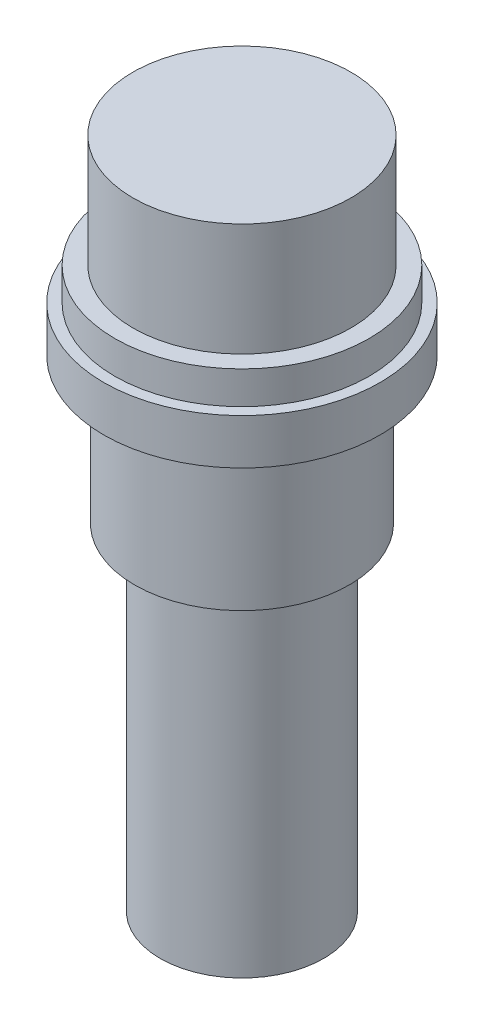
ISO-10303-21;
HEADER;
FILE_DESCRIPTION(('STEP AP214'),'2;1');
FILE_NAME('part.step','',(''),(''),'','','');
FILE_SCHEMA(('AUTOMOTIVE_DESIGN { 1 0 10303 214 1 1 1 1 }'));
ENDSEC;
DATA;
#1=APPLICATION_CONTEXT('core data for automotive mechanical design processes');
#2=APPLICATION_PROTOCOL_DEFINITION('international standard','automotive_design',2000,#1);
#3=PRODUCT_CONTEXT('',#1,'mechanical');
#4=PRODUCT('Part','Part','',(#3));
#5=PRODUCT_RELATED_PRODUCT_CATEGORY('part','',(#4));
#6=PRODUCT_DEFINITION_FORMATION('','',#4);
#7=PRODUCT_DEFINITION_CONTEXT('part definition',#1,'design');
#8=PRODUCT_DEFINITION('design','',#6,#7);
#9=PRODUCT_DEFINITION_SHAPE('','',#8);
#10=(LENGTH_UNIT() NAMED_UNIT(*) SI_UNIT(.MILLI.,.METRE.));
#11=(NAMED_UNIT(*) PLANE_ANGLE_UNIT() SI_UNIT($,.RADIAN.));
#12=(NAMED_UNIT(*) SI_UNIT($,.STERADIAN.) SOLID_ANGLE_UNIT());
#13=UNCERTAINTY_MEASURE_WITH_UNIT(LENGTH_MEASURE(1.E-05),#10,'distance_accuracy_value','');
#14=(GEOMETRIC_REPRESENTATION_CONTEXT(3) GLOBAL_UNCERTAINTY_ASSIGNED_CONTEXT((#13)) GLOBAL_UNIT_ASSIGNED_CONTEXT((#10,
#11,#12)) REPRESENTATION_CONTEXT('',''));
#15=CARTESIAN_POINT('',(0.,0.,0.));
#16=DIRECTION('',(0.,0.,1.));
#17=DIRECTION('',(1.,0.,0.));
#18=AXIS2_PLACEMENT_3D('',#15,#16,#17);
#19=CARTESIAN_POINT('',(4.50000000000001,-6.06130564302276,0.));
#20=DIRECTION('',(0.,1.,0.));
#21=DIRECTION('',(0.,0.,1.));
#22=AXIS2_PLACEMENT_3D('',#19,#20,#21);
#23=PLANE('',#22);
#24=CARTESIAN_POINT('',(0.,-6.06130564302276,0.));
#25=DIRECTION('',(0.,1.,0.));
#26=DIRECTION('',(0.,0.,1.));
#27=AXIS2_PLACEMENT_3D('',#24,#25,#26);
#28=CIRCLE('',#27,4.50000000000001);
#29=CARTESIAN_POINT('',(0.,-6.06130564302276,4.50000000000001));
#30=VERTEX_POINT('',#29);
#31=EDGE_CURVE('E10',#30,#30,#28,.T.);
#32=ORIENTED_EDGE('',*,*,#31,.F.);
#33=EDGE_LOOP('',(#32));
#34=FACE_BOUND('',#33,.T.);
#35=ADVANCED_FACE('F34',(#34),#23,.F.);
#36=CARTESIAN_POINT('',(0.,77.7218259629101,0.));
#37=DIRECTION('',(0.,1.,0.));
#38=DIRECTION('',(0.,0.,1.));
#39=AXIS2_PLACEMENT_3D('',#36,#37,#38);
#40=CYLINDRICAL_SURFACE('',#39,4.50000000000001);
#41=CARTESIAN_POINT('',(0.,12.4386943569772,0.));
#42=DIRECTION('',(0.,1.,0.));
#43=DIRECTION('',(0.,0.,1.));
#44=AXIS2_PLACEMENT_3D('',#41,#42,#43);
#45=CIRCLE('',#44,4.50000000000001);
#46=CARTESIAN_POINT('',(0.,12.4386943569772,4.50000000000001));
#47=VERTEX_POINT('',#46);
#48=EDGE_CURVE('E40',#47,#47,#45,.T.);
#49=ORIENTED_EDGE('',*,*,#48,.F.);
#50=EDGE_LOOP('',(#49));
#51=FACE_BOUND('',#50,.T.);
#52=ORIENTED_EDGE('',*,*,#31,.T.);
#53=EDGE_LOOP('',(#52));
#54=FACE_BOUND('',#53,.T.);
#55=ADVANCED_FACE('F118',(#51,#54),#40,.T.);
#56=CARTESIAN_POINT('',(5.90000000000001,12.4386943569772,0.));
#57=DIRECTION('',(0.,1.,0.));
#58=DIRECTION('',(0.,0.,1.));
#59=AXIS2_PLACEMENT_3D('',#56,#57,#58);
#60=PLANE('',#59);
#61=CARTESIAN_POINT('',(0.,12.4386943569772,0.));
#62=DIRECTION('',(0.,1.,0.));
#63=DIRECTION('',(0.,0.,1.));
#64=AXIS2_PLACEMENT_3D('',#61,#62,#63);
#65=CIRCLE('',#64,5.90000000000001);
#66=CARTESIAN_POINT('',(0.,12.4386943569772,5.90000000000001));
#67=VERTEX_POINT('',#66);
#68=EDGE_CURVE('E44',#67,#67,#65,.T.);
#69=ORIENTED_EDGE('',*,*,#68,.F.);
#70=EDGE_LOOP('',(#69));
#71=FACE_BOUND('',#70,.T.);
#72=ORIENTED_EDGE('',*,*,#48,.T.);
#73=EDGE_LOOP('',(#72));
#74=FACE_BOUND('',#73,.T.);
#75=ADVANCED_FACE('F113',(#71,#74),#60,.F.);
#76=CARTESIAN_POINT('',(0.,77.7218259629101,0.));
#77=DIRECTION('',(0.,1.,0.));
#78=DIRECTION('',(0.,0.,1.));
#79=AXIS2_PLACEMENT_3D('',#76,#77,#78);
#80=CYLINDRICAL_SURFACE('',#79,5.90000000000001);
#81=CARTESIAN_POINT('',(0.,20.4386943569772,0.));
#82=DIRECTION('',(0.,1.,0.));
#83=DIRECTION('',(0.,0.,1.));
#84=AXIS2_PLACEMENT_3D('',#81,#82,#83);
#85=CIRCLE('',#84,5.90000000000001);
#86=CARTESIAN_POINT('',(0.,20.4386943569772,5.90000000000001));
#87=VERTEX_POINT('',#86);
#88=EDGE_CURVE('E48',#87,#87,#85,.T.);
#89=ORIENTED_EDGE('',*,*,#88,.F.);
#90=EDGE_LOOP('',(#89));
#91=FACE_BOUND('',#90,.T.);
#92=ORIENTED_EDGE('',*,*,#68,.T.);
#93=EDGE_LOOP('',(#92));
#94=FACE_BOUND('',#93,.T.);
#95=ADVANCED_FACE('F107',(#91,#94),#80,.T.);
#96=CARTESIAN_POINT('',(7.60000000000001,20.4386943569772,0.));
#97=DIRECTION('',(0.,1.,0.));
#98=DIRECTION('',(0.,0.,1.));
#99=AXIS2_PLACEMENT_3D('',#96,#97,#98);
#100=PLANE('',#99);
#101=CARTESIAN_POINT('',(0.,20.4386943569772,0.));
#102=DIRECTION('',(0.,1.,0.));
#103=DIRECTION('',(0.,0.,1.));
#104=AXIS2_PLACEMENT_3D('',#101,#102,#103);
#105=CIRCLE('',#104,7.60000000000001);
#106=CARTESIAN_POINT('',(0.,20.4386943569772,7.60000000000001));
#107=VERTEX_POINT('',#106);
#108=EDGE_CURVE('E53',#107,#107,#105,.T.);
#109=ORIENTED_EDGE('',*,*,#108,.F.);
#110=EDGE_LOOP('',(#109));
#111=FACE_BOUND('',#110,.T.);
#112=ORIENTED_EDGE('',*,*,#88,.T.);
#113=EDGE_LOOP('',(#112));
#114=FACE_BOUND('',#113,.T.);
#115=ADVANCED_FACE('F101',(#111,#114),#100,.F.);
#116=CARTESIAN_POINT('',(0.,77.7218259629101,0.));
#117=DIRECTION('',(0.,1.,0.));
#118=DIRECTION('',(0.,0.,1.));
#119=AXIS2_PLACEMENT_3D('',#116,#117,#118);
#120=CYLINDRICAL_SURFACE('',#119,7.60000000000001);
#121=CARTESIAN_POINT('',(0.,22.9386943569772,0.));
#122=DIRECTION('',(0.,1.,0.));
#123=DIRECTION('',(0.,0.,1.));
#124=AXIS2_PLACEMENT_3D('',#121,#122,#123);
#125=CIRCLE('',#124,7.60000000000001);
#126=CARTESIAN_POINT('',(0.,22.9386943569772,7.60000000000001));
#127=VERTEX_POINT('',#126);
#128=EDGE_CURVE('E56',#127,#127,#125,.T.);
#129=ORIENTED_EDGE('',*,*,#128,.F.);
#130=EDGE_LOOP('',(#129));
#131=FACE_BOUND('',#130,.T.);
#132=ORIENTED_EDGE('',*,*,#108,.T.);
#133=EDGE_LOOP('',(#132));
#134=FACE_BOUND('',#133,.T.);
#135=ADVANCED_FACE('F95',(#131,#134),#120,.T.);
#136=CARTESIAN_POINT('',(7.00000000000001,22.9386943569772,0.));
#137=DIRECTION('',(0.,-1.,0.));
#138=DIRECTION('',(0.,0.,-1.));
#139=AXIS2_PLACEMENT_3D('',#136,#137,#138);
#140=PLANE('',#139);
#141=CARTESIAN_POINT('',(0.,22.9386943569772,0.));
#142=DIRECTION('',(0.,1.,0.));
#143=DIRECTION('',(0.,0.,1.));
#144=AXIS2_PLACEMENT_3D('',#141,#142,#143);
#145=CIRCLE('',#144,7.00000000000001);
#146=CARTESIAN_POINT('',(0.,22.9386943569772,7.00000000000001));
#147=VERTEX_POINT('',#146);
#148=EDGE_CURVE('E59',#147,#147,#145,.T.);
#149=ORIENTED_EDGE('',*,*,#148,.F.);
#150=EDGE_LOOP('',(#149));
#151=FACE_BOUND('',#150,.T.);
#152=ORIENTED_EDGE('',*,*,#128,.T.);
#153=EDGE_LOOP('',(#152));
#154=FACE_BOUND('',#153,.T.);
#155=ADVANCED_FACE('F89',(#151,#154),#140,.F.);
#156=CARTESIAN_POINT('',(0.,77.7218259629101,0.));
#157=DIRECTION('',(0.,1.,0.));
#158=DIRECTION('',(0.,0.,1.));
#159=AXIS2_PLACEMENT_3D('',#156,#157,#158);
#160=CYLINDRICAL_SURFACE('',#159,7.00000000000001);
#161=CARTESIAN_POINT('',(0.,24.7386943569772,0.));
#162=DIRECTION('',(0.,1.,0.));
#163=DIRECTION('',(0.,0.,1.));
#164=AXIS2_PLACEMENT_3D('',#161,#162,#163);
#165=CIRCLE('',#164,7.00000000000001);
#166=CARTESIAN_POINT('',(0.,24.7386943569772,7.00000000000001));
#167=VERTEX_POINT('',#166);
#168=EDGE_CURVE('E62',#167,#167,#165,.T.);
#169=ORIENTED_EDGE('',*,*,#168,.F.);
#170=EDGE_LOOP('',(#169));
#171=FACE_BOUND('',#170,.T.);
#172=ORIENTED_EDGE('',*,*,#148,.T.);
#173=EDGE_LOOP('',(#172));
#174=FACE_BOUND('',#173,.T.);
#175=ADVANCED_FACE('F83',(#171,#174),#160,.T.);
#176=CARTESIAN_POINT('',(6.00000000000001,24.7386943569772,0.));
#177=DIRECTION('',(0.,-1.,0.));
#178=DIRECTION('',(0.,0.,-1.));
#179=AXIS2_PLACEMENT_3D('',#176,#177,#178);
#180=PLANE('',#179);
#181=CARTESIAN_POINT('',(0.,24.7386943569772,0.));
#182=DIRECTION('',(0.,1.,0.));
#183=DIRECTION('',(0.,0.,1.));
#184=AXIS2_PLACEMENT_3D('',#181,#182,#183);
#185=CIRCLE('',#184,6.00000000000001);
#186=CARTESIAN_POINT('',(0.,24.7386943569772,6.00000000000001));
#187=VERTEX_POINT('',#186);
#188=EDGE_CURVE('E65',#187,#187,#185,.T.);
#189=ORIENTED_EDGE('',*,*,#188,.F.);
#190=EDGE_LOOP('',(#189));
#191=FACE_BOUND('',#190,.T.);
#192=ORIENTED_EDGE('',*,*,#168,.T.);
#193=EDGE_LOOP('',(#192));
#194=FACE_BOUND('',#193,.T.);
#195=ADVANCED_FACE('F77',(#191,#194),#180,.F.);
#196=CARTESIAN_POINT('',(0.,77.7218259629101,0.));
#197=DIRECTION('',(0.,1.,0.));
#198=DIRECTION('',(0.,0.,1.));
#199=AXIS2_PLACEMENT_3D('',#196,#197,#198);
#200=CYLINDRICAL_SURFACE('',#199,6.00000000000001);
#201=CARTESIAN_POINT('',(0.,30.9386943569772,0.));
#202=DIRECTION('',(0.,1.,0.));
#203=DIRECTION('',(0.,0.,1.));
#204=AXIS2_PLACEMENT_3D('',#201,#202,#203);
#205=CIRCLE('',#204,6.00000000000001);
#206=CARTESIAN_POINT('',(0.,30.9386943569772,6.00000000000001));
#207=VERTEX_POINT('',#206);
#208=EDGE_CURVE('E68',#207,#207,#205,.T.);
#209=ORIENTED_EDGE('',*,*,#208,.F.);
#210=EDGE_LOOP('',(#209));
#211=FACE_BOUND('',#210,.T.);
#212=ORIENTED_EDGE('',*,*,#188,.T.);
#213=EDGE_LOOP('',(#212));
#214=FACE_BOUND('',#213,.T.);
#215=ADVANCED_FACE('F74',(#211,#214),#200,.T.);
#216=CARTESIAN_POINT('',(0.,30.9386943569772,0.));
#217=DIRECTION('',(0.,-1.,0.));
#218=DIRECTION('',(0.,0.,-1.));
#219=AXIS2_PLACEMENT_3D('',#216,#217,#218);
#220=PLANE('',#219);
#221=ORIENTED_EDGE('',*,*,#208,.T.);
#222=EDGE_LOOP('',(#221));
#223=FACE_BOUND('',#222,.T.);
#224=ADVANCED_FACE('F72',(#223),#220,.F.);
#225=CLOSED_SHELL('',(#35,#55,#75,#95,#115,#135,#155,#175,#195,#215,#224));
#226=MANIFOLD_SOLID_BREP('B2',#225);
#227=ADVANCED_BREP_SHAPE_REPRESENTATION('',(#18,#226),#14);
#228=SHAPE_DEFINITION_REPRESENTATION(#9,#227);
ENDSEC;
END-ISO-10303-21;
